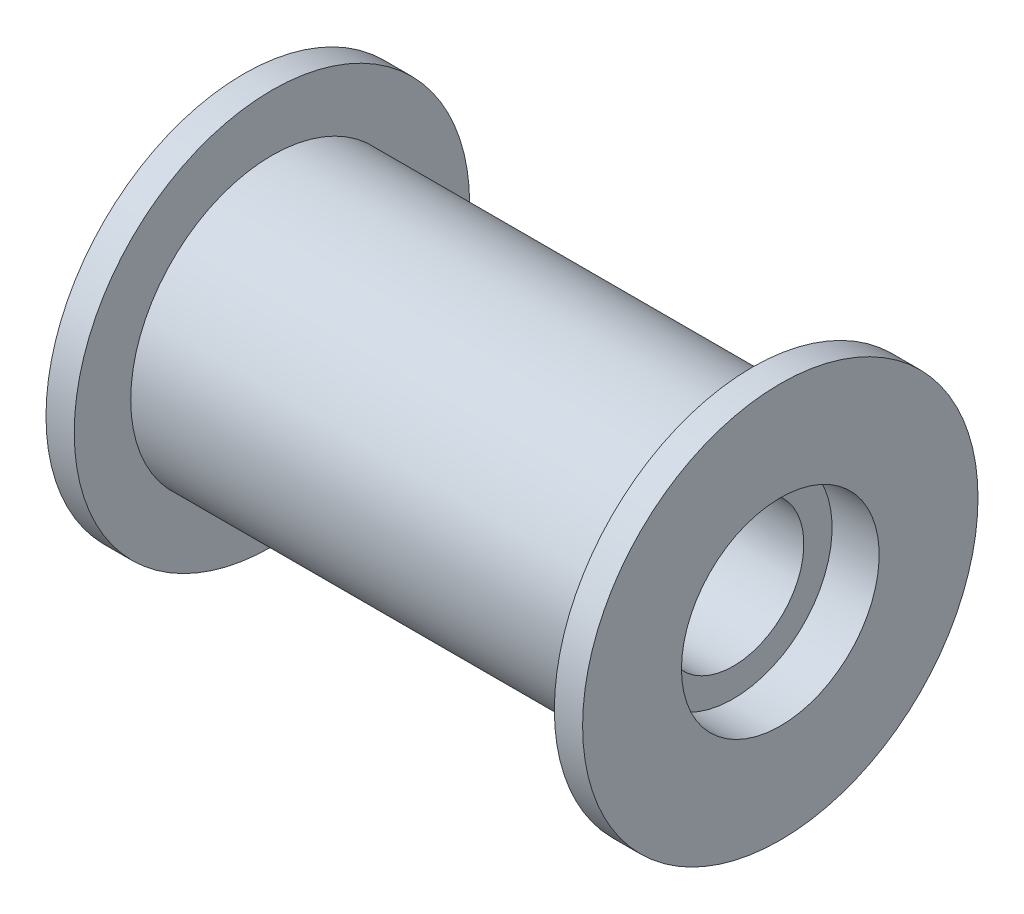
ISO-10303-21;
HEADER;
FILE_DESCRIPTION(('STEP AP214'),'2;1');
FILE_NAME('part.step','',(''),(''),'','','');
FILE_SCHEMA(('AUTOMOTIVE_DESIGN { 1 0 10303 214 1 1 1 1 }'));
ENDSEC;
DATA;
#1=APPLICATION_CONTEXT('core data for automotive mechanical design processes');
#2=APPLICATION_PROTOCOL_DEFINITION('international standard','automotive_design',2000,#1);
#3=PRODUCT_CONTEXT('',#1,'mechanical');
#4=PRODUCT('Part','Part','',(#3));
#5=PRODUCT_RELATED_PRODUCT_CATEGORY('part','',(#4));
#6=PRODUCT_DEFINITION_FORMATION('','',#4);
#7=PRODUCT_DEFINITION_CONTEXT('part definition',#1,'design');
#8=PRODUCT_DEFINITION('design','',#6,#7);
#9=PRODUCT_DEFINITION_SHAPE('','',#8);
#10=(LENGTH_UNIT() NAMED_UNIT(*) SI_UNIT(.MILLI.,.METRE.));
#11=(NAMED_UNIT(*) PLANE_ANGLE_UNIT() SI_UNIT($,.RADIAN.));
#12=(NAMED_UNIT(*) SI_UNIT($,.STERADIAN.) SOLID_ANGLE_UNIT());
#13=UNCERTAINTY_MEASURE_WITH_UNIT(LENGTH_MEASURE(1.E-05),#10,'distance_accuracy_value','');
#14=(GEOMETRIC_REPRESENTATION_CONTEXT(3) GLOBAL_UNCERTAINTY_ASSIGNED_CONTEXT((#13)) GLOBAL_UNIT_ASSIGNED_CONTEXT((#10,
#11,#12)) REPRESENTATION_CONTEXT('',''));
#15=CARTESIAN_POINT('',(0.,0.,0.));
#16=DIRECTION('',(0.,0.,1.));
#17=DIRECTION('',(1.,0.,0.));
#18=AXIS2_PLACEMENT_3D('',#15,#16,#17);
#19=CARTESIAN_POINT('',(55.,0.,0.));
#20=DIRECTION('',(1.,0.,0.));
#21=DIRECTION('',(0.,0.,-1.));
#22=AXIS2_PLACEMENT_3D('',#19,#20,#21);
#23=PLANE('',#22);
#24=CARTESIAN_POINT('',(55.,0.,0.));
#25=DIRECTION('',(-1.,0.,0.));
#26=DIRECTION('',(0.,0.,1.));
#27=AXIS2_PLACEMENT_3D('',#24,#25,#26);
#28=CIRCLE('',#27,7.49999999999999);
#29=CARTESIAN_POINT('',(55.,0.,7.49999999999999));
#30=VERTEX_POINT('',#29);
#31=EDGE_CURVE('E72',#30,#30,#28,.T.);
#32=ORIENTED_EDGE('',*,*,#31,.T.);
#33=EDGE_LOOP('',(#32));
#34=FACE_BOUND('',#33,.T.);
#35=CARTESIAN_POINT('',(55.,0.,0.));
#36=DIRECTION('',(-1.,0.,0.));
#37=DIRECTION('',(0.,0.,1.));
#38=AXIS2_PLACEMENT_3D('',#35,#36,#37);
#39=CIRCLE('',#38,10.5);
#40=CARTESIAN_POINT('',(55.,0.,10.5));
#41=VERTEX_POINT('',#40);
#42=EDGE_CURVE('E10',#41,#41,#39,.T.);
#43=ORIENTED_EDGE('',*,*,#42,.F.);
#44=EDGE_LOOP('',(#43));
#45=FACE_BOUND('',#44,.T.);
#46=ADVANCED_FACE('F32',(#34,#45),#23,.T.);
#47=CARTESIAN_POINT('',(0.,0.,0.));
#48=DIRECTION('',(-1.,0.,0.));
#49=DIRECTION('',(0.,0.,1.));
#50=AXIS2_PLACEMENT_3D('',#47,#48,#49);
#51=CYLINDRICAL_SURFACE('',#50,10.5);
#52=ORIENTED_EDGE('',*,*,#42,.T.);
#53=EDGE_LOOP('',(#52));
#54=FACE_BOUND('',#53,.T.);
#55=CARTESIAN_POINT('',(60.,0.,0.));
#56=DIRECTION('',(-1.,0.,0.));
#57=DIRECTION('',(0.,0.,1.));
#58=AXIS2_PLACEMENT_3D('',#55,#56,#57);
#59=CIRCLE('',#58,10.5);
#60=CARTESIAN_POINT('',(60.,0.,10.5));
#61=VERTEX_POINT('',#60);
#62=EDGE_CURVE('E38',#61,#61,#59,.T.);
#63=ORIENTED_EDGE('',*,*,#62,.F.);
#64=EDGE_LOOP('',(#63));
#65=FACE_BOUND('',#64,.T.);
#66=ADVANCED_FACE('F102',(#54,#65),#51,.F.);
#67=CARTESIAN_POINT('',(60.,0.,0.));
#68=DIRECTION('',(1.,0.,0.));
#69=DIRECTION('',(0.,0.,-1.));
#70=AXIS2_PLACEMENT_3D('',#67,#68,#69);
#71=PLANE('',#70);
#72=ORIENTED_EDGE('',*,*,#62,.T.);
#73=EDGE_LOOP('',(#72));
#74=FACE_BOUND('',#73,.T.);
#75=CARTESIAN_POINT('',(60.,0.,0.));
#76=DIRECTION('',(-1.,0.,0.));
#77=DIRECTION('',(0.,0.,1.));
#78=AXIS2_PLACEMENT_3D('',#75,#76,#77);
#79=CIRCLE('',#78,21.);
#80=CARTESIAN_POINT('',(60.,0.,21.));
#81=VERTEX_POINT('',#80);
#82=EDGE_CURVE('E42',#81,#81,#79,.T.);
#83=ORIENTED_EDGE('',*,*,#82,.F.);
#84=EDGE_LOOP('',(#83));
#85=FACE_BOUND('',#84,.T.);
#86=ADVANCED_FACE('F106',(#74,#85),#71,.T.);
#87=CARTESIAN_POINT('',(0.,0.,0.));
#88=DIRECTION('',(-1.,0.,0.));
#89=DIRECTION('',(0.,0.,1.));
#90=AXIS2_PLACEMENT_3D('',#87,#88,#89);
#91=CYLINDRICAL_SURFACE('',#90,21.);
#92=ORIENTED_EDGE('',*,*,#82,.T.);
#93=EDGE_LOOP('',(#92));
#94=FACE_BOUND('',#93,.T.);
#95=CARTESIAN_POINT('',(57.,0.,0.));
#96=DIRECTION('',(-1.,0.,0.));
#97=DIRECTION('',(0.,0.,1.));
#98=AXIS2_PLACEMENT_3D('',#95,#96,#97);
#99=CIRCLE('',#98,21.);
#100=CARTESIAN_POINT('',(57.,0.,21.));
#101=VERTEX_POINT('',#100);
#102=EDGE_CURVE('E46',#101,#101,#99,.T.);
#103=ORIENTED_EDGE('',*,*,#102,.F.);
#104=EDGE_LOOP('',(#103));
#105=FACE_BOUND('',#104,.T.);
#106=ADVANCED_FACE('F110',(#94,#105),#91,.T.);
#107=CARTESIAN_POINT('',(57.,0.,0.));
#108=DIRECTION('',(-1.,0.,0.));
#109=DIRECTION('',(0.,0.,1.));
#110=AXIS2_PLACEMENT_3D('',#107,#108,#109);
#111=PLANE('',#110);
#112=ORIENTED_EDGE('',*,*,#102,.T.);
#113=EDGE_LOOP('',(#112));
#114=FACE_BOUND('',#113,.T.);
#115=CARTESIAN_POINT('',(57.,0.,0.));
#116=DIRECTION('',(-1.,0.,0.));
#117=DIRECTION('',(0.,0.,1.));
#118=AXIS2_PLACEMENT_3D('',#115,#116,#117);
#119=CIRCLE('',#118,15.);
#120=CARTESIAN_POINT('',(57.,0.,15.));
#121=VERTEX_POINT('',#120);
#122=EDGE_CURVE('E51',#121,#121,#119,.T.);
#123=ORIENTED_EDGE('',*,*,#122,.F.);
#124=EDGE_LOOP('',(#123));
#125=FACE_BOUND('',#124,.T.);
#126=ADVANCED_FACE('F116',(#114,#125),#111,.T.);
#127=CARTESIAN_POINT('',(0.,0.,0.));
#128=DIRECTION('',(-1.,0.,0.));
#129=DIRECTION('',(0.,0.,1.));
#130=AXIS2_PLACEMENT_3D('',#127,#128,#129);
#131=CYLINDRICAL_SURFACE('',#130,15.);
#132=ORIENTED_EDGE('',*,*,#122,.T.);
#133=EDGE_LOOP('',(#132));
#134=FACE_BOUND('',#133,.T.);
#135=CARTESIAN_POINT('',(6.00000000000001,0.,0.));
#136=DIRECTION('',(-1.,0.,0.));
#137=DIRECTION('',(0.,0.,1.));
#138=AXIS2_PLACEMENT_3D('',#135,#136,#137);
#139=CIRCLE('',#138,15.);
#140=CARTESIAN_POINT('',(6.00000000000001,0.,15.));
#141=VERTEX_POINT('',#140);
#142=EDGE_CURVE('E54',#141,#141,#139,.T.);
#143=ORIENTED_EDGE('',*,*,#142,.F.);
#144=EDGE_LOOP('',(#143));
#145=FACE_BOUND('',#144,.T.);
#146=ADVANCED_FACE('F120',(#134,#145),#131,.T.);
#147=CARTESIAN_POINT('',(6.00000000000001,0.,0.));
#148=DIRECTION('',(1.,0.,0.));
#149=DIRECTION('',(0.,0.,-1.));
#150=AXIS2_PLACEMENT_3D('',#147,#148,#149);
#151=PLANE('',#150);
#152=ORIENTED_EDGE('',*,*,#142,.T.);
#153=EDGE_LOOP('',(#152));
#154=FACE_BOUND('',#153,.T.);
#155=CARTESIAN_POINT('',(6.00000000000001,0.,0.));
#156=DIRECTION('',(-1.,0.,0.));
#157=DIRECTION('',(0.,0.,1.));
#158=AXIS2_PLACEMENT_3D('',#155,#156,#157);
#159=CIRCLE('',#158,21.);
#160=CARTESIAN_POINT('',(6.00000000000001,0.,21.));
#161=VERTEX_POINT('',#160);
#162=EDGE_CURVE('E57',#161,#161,#159,.T.);
#163=ORIENTED_EDGE('',*,*,#162,.F.);
#164=EDGE_LOOP('',(#163));
#165=FACE_BOUND('',#164,.T.);
#166=ADVANCED_FACE('F124',(#154,#165),#151,.T.);
#167=CARTESIAN_POINT('',(0.,0.,0.));
#168=DIRECTION('',(-1.,0.,0.));
#169=DIRECTION('',(0.,0.,1.));
#170=AXIS2_PLACEMENT_3D('',#167,#168,#169);
#171=CYLINDRICAL_SURFACE('',#170,21.);
#172=ORIENTED_EDGE('',*,*,#162,.T.);
#173=EDGE_LOOP('',(#172));
#174=FACE_BOUND('',#173,.T.);
#175=CARTESIAN_POINT('',(3.00000000000001,0.,0.));
#176=DIRECTION('',(-1.,0.,0.));
#177=DIRECTION('',(0.,0.,1.));
#178=AXIS2_PLACEMENT_3D('',#175,#176,#177);
#179=CIRCLE('',#178,21.);
#180=CARTESIAN_POINT('',(3.00000000000001,0.,21.));
#181=VERTEX_POINT('',#180);
#182=EDGE_CURVE('E60',#181,#181,#179,.T.);
#183=ORIENTED_EDGE('',*,*,#182,.F.);
#184=EDGE_LOOP('',(#183));
#185=FACE_BOUND('',#184,.T.);
#186=ADVANCED_FACE('F98',(#174,#185),#171,.T.);
#187=CARTESIAN_POINT('',(3.00000000000001,0.,0.));
#188=DIRECTION('',(-1.,0.,0.));
#189=DIRECTION('',(0.,0.,1.));
#190=AXIS2_PLACEMENT_3D('',#187,#188,#189);
#191=PLANE('',#190);
#192=ORIENTED_EDGE('',*,*,#182,.T.);
#193=EDGE_LOOP('',(#192));
#194=FACE_BOUND('',#193,.T.);
#195=CARTESIAN_POINT('',(3.00000000000001,0.,0.));
#196=DIRECTION('',(-1.,0.,0.));
#197=DIRECTION('',(0.,0.,1.));
#198=AXIS2_PLACEMENT_3D('',#195,#196,#197);
#199=CIRCLE('',#198,10.5);
#200=CARTESIAN_POINT('',(3.00000000000001,0.,10.5));
#201=VERTEX_POINT('',#200);
#202=EDGE_CURVE('E63',#201,#201,#199,.T.);
#203=ORIENTED_EDGE('',*,*,#202,.F.);
#204=EDGE_LOOP('',(#203));
#205=FACE_BOUND('',#204,.T.);
#206=ADVANCED_FACE('F92',(#194,#205),#191,.T.);
#207=CARTESIAN_POINT('',(0.,0.,0.));
#208=DIRECTION('',(-1.,0.,0.));
#209=DIRECTION('',(0.,0.,1.));
#210=AXIS2_PLACEMENT_3D('',#207,#208,#209);
#211=CYLINDRICAL_SURFACE('',#210,10.5);
#212=ORIENTED_EDGE('',*,*,#202,.T.);
#213=EDGE_LOOP('',(#212));
#214=FACE_BOUND('',#213,.T.);
#215=CARTESIAN_POINT('',(8.00000000000001,0.,0.));
#216=DIRECTION('',(-1.,0.,0.));
#217=DIRECTION('',(0.,0.,1.));
#218=AXIS2_PLACEMENT_3D('',#215,#216,#217);
#219=CIRCLE('',#218,10.5);
#220=CARTESIAN_POINT('',(8.00000000000001,0.,10.5));
#221=VERTEX_POINT('',#220);
#222=EDGE_CURVE('E66',#221,#221,#219,.T.);
#223=ORIENTED_EDGE('',*,*,#222,.F.);
#224=EDGE_LOOP('',(#223));
#225=FACE_BOUND('',#224,.T.);
#226=ADVANCED_FACE('F87',(#214,#225),#211,.F.);
#227=CARTESIAN_POINT('',(8.00000000000001,0.,0.));
#228=DIRECTION('',(1.,0.,0.));
#229=DIRECTION('',(0.,0.,-1.));
#230=AXIS2_PLACEMENT_3D('',#227,#228,#229);
#231=PLANE('',#230);
#232=CARTESIAN_POINT('',(8.00000000000001,0.,0.));
#233=DIRECTION('',(-1.,0.,0.));
#234=DIRECTION('',(0.,0.,1.));
#235=AXIS2_PLACEMENT_3D('',#232,#233,#234);
#236=CIRCLE('',#235,7.49999999999999);
#237=CARTESIAN_POINT('',(8.00000000000001,0.,7.49999999999999));
#238=VERTEX_POINT('',#237);
#239=EDGE_CURVE('E69',#238,#238,#236,.T.);
#240=ORIENTED_EDGE('',*,*,#239,.F.);
#241=EDGE_LOOP('',(#240));
#242=FACE_BOUND('',#241,.T.);
#243=ORIENTED_EDGE('',*,*,#222,.T.);
#244=EDGE_LOOP('',(#243));
#245=FACE_BOUND('',#244,.T.);
#246=ADVANCED_FACE('F81',(#242,#245),#231,.F.);
#247=CARTESIAN_POINT('',(0.,0.,0.));
#248=DIRECTION('',(-1.,0.,0.));
#249=DIRECTION('',(0.,0.,1.));
#250=AXIS2_PLACEMENT_3D('',#247,#248,#249);
#251=CYLINDRICAL_SURFACE('',#250,7.49999999999999);
#252=ORIENTED_EDGE('',*,*,#31,.F.);
#253=EDGE_LOOP('',(#252));
#254=FACE_BOUND('',#253,.T.);
#255=ORIENTED_EDGE('',*,*,#239,.T.);
#256=EDGE_LOOP('',(#255));
#257=FACE_BOUND('',#256,.T.);
#258=ADVANCED_FACE('F78',(#254,#257),#251,.F.);
#259=CLOSED_SHELL('',(#46,#66,#86,#106,#126,#146,#166,#186,#206,#226,#246,#258));
#260=MANIFOLD_SOLID_BREP('B2',#259);
#261=ADVANCED_BREP_SHAPE_REPRESENTATION('',(#18,#260),#14);
#262=SHAPE_DEFINITION_REPRESENTATION(#9,#261);
ENDSEC;
END-ISO-10303-21;
